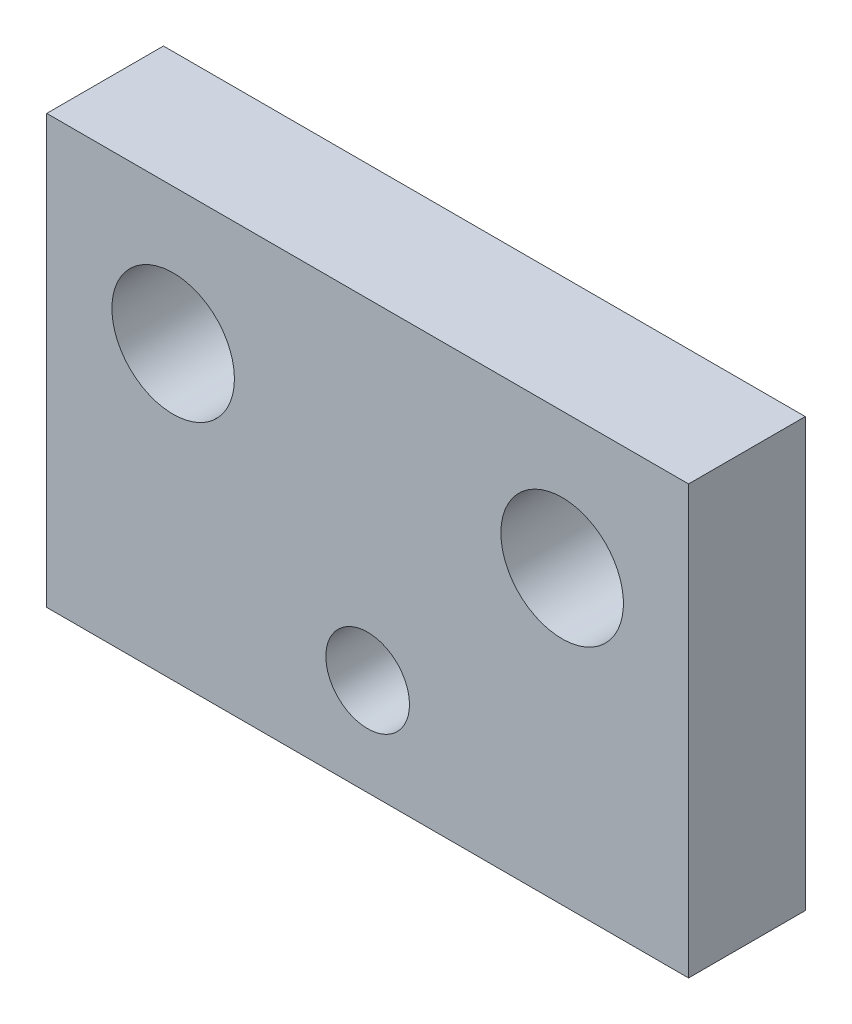
ISO-10303-21;
HEADER;
FILE_DESCRIPTION(('STEP AP214'),'2;1');
FILE_NAME('part.step','',(''),(''),'','','');
FILE_SCHEMA(('AUTOMOTIVE_DESIGN { 1 0 10303 214 1 1 1 1 }'));
ENDSEC;
DATA;
#1=APPLICATION_CONTEXT('core data for automotive mechanical design processes');
#2=APPLICATION_PROTOCOL_DEFINITION('international standard','automotive_design',2000,#1);
#3=PRODUCT_CONTEXT('',#1,'mechanical');
#4=PRODUCT('Part','Part','',(#3));
#5=PRODUCT_RELATED_PRODUCT_CATEGORY('part','',(#4));
#6=PRODUCT_DEFINITION_FORMATION('','',#4);
#7=PRODUCT_DEFINITION_CONTEXT('part definition',#1,'design');
#8=PRODUCT_DEFINITION('design','',#6,#7);
#9=PRODUCT_DEFINITION_SHAPE('','',#8);
#10=(LENGTH_UNIT() NAMED_UNIT(*) SI_UNIT(.MILLI.,.METRE.));
#11=(NAMED_UNIT(*) PLANE_ANGLE_UNIT() SI_UNIT($,.RADIAN.));
#12=(NAMED_UNIT(*) SI_UNIT($,.STERADIAN.) SOLID_ANGLE_UNIT());
#13=UNCERTAINTY_MEASURE_WITH_UNIT(LENGTH_MEASURE(1.E-05),#10,'distance_accuracy_value','');
#14=(GEOMETRIC_REPRESENTATION_CONTEXT(3) GLOBAL_UNCERTAINTY_ASSIGNED_CONTEXT((#13)) GLOBAL_UNIT_ASSIGNED_CONTEXT((#10,
#11,#12)) REPRESENTATION_CONTEXT('',''));
#15=CARTESIAN_POINT('',(0.,0.,0.));
#16=DIRECTION('',(0.,0.,1.));
#17=DIRECTION('',(1.,0.,0.));
#18=AXIS2_PLACEMENT_3D('',#15,#16,#17);
#19=CARTESIAN_POINT('',(0.,0.,6.));
#20=DIRECTION('',(0.,0.,1.));
#21=DIRECTION('',(1.,0.,0.));
#22=AXIS2_PLACEMENT_3D('',#19,#20,#21);
#23=PLANE('',#22);
#24=CARTESIAN_POINT('',(0.,5.,6.));
#25=DIRECTION('',(0.,0.,1.));
#26=DIRECTION('',(1.,0.,0.));
#27=AXIS2_PLACEMENT_3D('',#24,#25,#26);
#28=CIRCLE('',#27,2.15);
#29=CARTESIAN_POINT('',(2.14999999999999,5.,6.));
#30=VERTEX_POINT('',#29);
#31=EDGE_CURVE('E141',#30,#30,#28,.T.);
#32=ORIENTED_EDGE('',*,*,#31,.F.);
#33=EDGE_LOOP('',(#32));
#34=FACE_BOUND('',#33,.T.);
#35=DIRECTION('',(0.,1.,0.));
#36=VECTOR('',#35,1.);
#37=CARTESIAN_POINT('',(16.5,22.,6.));
#38=LINE('',#37,#36);
#39=CARTESIAN_POINT('',(16.5,0.,6.));
#40=VERTEX_POINT('',#39);
#41=CARTESIAN_POINT('',(16.5,22.,6.));
#42=VERTEX_POINT('',#41);
#43=EDGE_CURVE('E98',#40,#42,#38,.T.);
#44=ORIENTED_EDGE('',*,*,#43,.T.);
#45=DIRECTION('',(-1.,0.,0.));
#46=VECTOR('',#45,1.);
#47=CARTESIAN_POINT('',(-16.5,22.,6.));
#48=LINE('',#47,#46);
#49=CARTESIAN_POINT('',(-16.5,22.,6.));
#50=VERTEX_POINT('',#49);
#51=EDGE_CURVE('E93',#42,#50,#48,.T.);
#52=ORIENTED_EDGE('',*,*,#51,.T.);
#53=DIRECTION('',(0.,-1.,0.));
#54=VECTOR('',#53,1.);
#55=CARTESIAN_POINT('',(-16.5,22.,6.));
#56=LINE('',#55,#54);
#57=CARTESIAN_POINT('',(-16.5,0.,6.));
#58=VERTEX_POINT('',#57);
#59=EDGE_CURVE('E96',#50,#58,#56,.T.);
#60=ORIENTED_EDGE('',*,*,#59,.T.);
#61=DIRECTION('',(1.,0.,0.));
#62=VECTOR('',#61,1.);
#63=CARTESIAN_POINT('',(-16.5,0.,6.));
#64=LINE('',#63,#62);
#65=EDGE_CURVE('E63',#58,#40,#64,.T.);
#66=ORIENTED_EDGE('',*,*,#65,.T.);
#67=EDGE_LOOP('',(#44,#52,#60,#66));
#68=FACE_BOUND('',#67,.T.);
#69=CARTESIAN_POINT('',(-10.,15.,6.));
#70=DIRECTION('',(0.,0.,1.));
#71=DIRECTION('',(1.,0.,0.));
#72=AXIS2_PLACEMENT_3D('',#69,#70,#71);
#73=CIRCLE('',#72,3.15);
#74=CARTESIAN_POINT('',(-6.85,15.,6.));
#75=VERTEX_POINT('',#74);
#76=EDGE_CURVE('E120',#75,#75,#73,.T.);
#77=ORIENTED_EDGE('',*,*,#76,.F.);
#78=EDGE_LOOP('',(#77));
#79=FACE_BOUND('',#78,.T.);
#80=CARTESIAN_POINT('',(10.,15.,6.));
#81=DIRECTION('',(0.,0.,1.));
#82=DIRECTION('',(-1.,0.,0.));
#83=AXIS2_PLACEMENT_3D('',#80,#81,#82);
#84=CIRCLE('',#83,3.15);
#85=CARTESIAN_POINT('',(6.85,15.,6.));
#86=VERTEX_POINT('',#85);
#87=EDGE_CURVE('E149',#86,#86,#84,.T.);
#88=ORIENTED_EDGE('',*,*,#87,.F.);
#89=EDGE_LOOP('',(#88));
#90=FACE_BOUND('',#89,.T.);
#91=ADVANCED_FACE('F45',(#34,#68,#79,#90),#23,.T.);
#92=CARTESIAN_POINT('',(0.,0.,0.));
#93=DIRECTION('',(0.,0.,1.));
#94=DIRECTION('',(1.,0.,0.));
#95=AXIS2_PLACEMENT_3D('',#92,#93,#94);
#96=PLANE('',#95);
#97=DIRECTION('',(0.,1.,0.));
#98=VECTOR('',#97,1.);
#99=CARTESIAN_POINT('',(16.5,22.,0.));
#100=LINE('',#99,#98);
#101=CARTESIAN_POINT('',(16.5,0.,0.));
#102=VERTEX_POINT('',#101);
#103=CARTESIAN_POINT('',(16.5,22.,0.));
#104=VERTEX_POINT('',#103);
#105=EDGE_CURVE('E116',#102,#104,#100,.T.);
#106=ORIENTED_EDGE('',*,*,#105,.F.);
#107=DIRECTION('',(1.,0.,0.));
#108=VECTOR('',#107,1.);
#109=CARTESIAN_POINT('',(-16.5,0.,0.));
#110=LINE('',#109,#108);
#111=CARTESIAN_POINT('',(-16.5,0.,0.));
#112=VERTEX_POINT('',#111);
#113=EDGE_CURVE('E86',#112,#102,#110,.T.);
#114=ORIENTED_EDGE('',*,*,#113,.F.);
#115=DIRECTION('',(0.,-1.,0.));
#116=VECTOR('',#115,1.);
#117=CARTESIAN_POINT('',(-16.5,22.,0.));
#118=LINE('',#117,#116);
#119=CARTESIAN_POINT('',(-16.5,22.,0.));
#120=VERTEX_POINT('',#119);
#121=EDGE_CURVE('E80',#120,#112,#118,.T.);
#122=ORIENTED_EDGE('',*,*,#121,.F.);
#123=DIRECTION('',(-1.,0.,0.));
#124=VECTOR('',#123,1.);
#125=CARTESIAN_POINT('',(-16.5,22.,0.));
#126=LINE('',#125,#124);
#127=EDGE_CURVE('E103',#104,#120,#126,.T.);
#128=ORIENTED_EDGE('',*,*,#127,.F.);
#129=EDGE_LOOP('',(#106,#114,#122,#128));
#130=FACE_BOUND('',#129,.T.);
#131=CARTESIAN_POINT('',(-10.,15.,0.));
#132=DIRECTION('',(0.,0.,1.));
#133=DIRECTION('',(1.,0.,0.));
#134=AXIS2_PLACEMENT_3D('',#131,#132,#133);
#135=CIRCLE('',#134,3.15);
#136=CARTESIAN_POINT('',(-6.85,15.,0.));
#137=VERTEX_POINT('',#136);
#138=EDGE_CURVE('E137',#137,#137,#135,.T.);
#139=ORIENTED_EDGE('',*,*,#138,.T.);
#140=EDGE_LOOP('',(#139));
#141=FACE_BOUND('',#140,.T.);
#142=CARTESIAN_POINT('',(0.,5.,0.));
#143=DIRECTION('',(0.,0.,1.));
#144=DIRECTION('',(1.,0.,0.));
#145=AXIS2_PLACEMENT_3D('',#142,#143,#144);
#146=CIRCLE('',#145,2.15);
#147=CARTESIAN_POINT('',(2.14999999999999,5.,0.));
#148=VERTEX_POINT('',#147);
#149=EDGE_CURVE('E145',#148,#148,#146,.T.);
#150=ORIENTED_EDGE('',*,*,#149,.T.);
#151=EDGE_LOOP('',(#150));
#152=FACE_BOUND('',#151,.T.);
#153=CARTESIAN_POINT('',(10.,15.,0.));
#154=DIRECTION('',(0.,0.,1.));
#155=DIRECTION('',(-1.,0.,0.));
#156=AXIS2_PLACEMENT_3D('',#153,#154,#155);
#157=CIRCLE('',#156,3.15);
#158=CARTESIAN_POINT('',(6.85,15.,0.));
#159=VERTEX_POINT('',#158);
#160=EDGE_CURVE('E153',#159,#159,#157,.T.);
#161=ORIENTED_EDGE('',*,*,#160,.T.);
#162=EDGE_LOOP('',(#161));
#163=FACE_BOUND('',#162,.T.);
#164=ADVANCED_FACE('F131',(#130,#141,#152,#163),#96,.F.);
#165=CARTESIAN_POINT('',(16.5,22.,6.));
#166=DIRECTION('',(-1.,0.,0.));
#167=DIRECTION('',(0.,0.,1.));
#168=AXIS2_PLACEMENT_3D('',#165,#166,#167);
#169=PLANE('',#168);
#170=ORIENTED_EDGE('',*,*,#105,.T.);
#171=DIRECTION('',(0.,0.,-1.));
#172=VECTOR('',#171,1.);
#173=CARTESIAN_POINT('',(16.5,22.,6.));
#174=LINE('',#173,#172);
#175=EDGE_CURVE('E11',#42,#104,#174,.T.);
#176=ORIENTED_EDGE('',*,*,#175,.F.);
#177=ORIENTED_EDGE('',*,*,#43,.F.);
#178=DIRECTION('',(0.,0.,-1.));
#179=VECTOR('',#178,1.);
#180=CARTESIAN_POINT('',(16.5,0.,6.));
#181=LINE('',#180,#179);
#182=EDGE_CURVE('E112',#40,#102,#181,.T.);
#183=ORIENTED_EDGE('',*,*,#182,.T.);
#184=EDGE_LOOP('',(#170,#176,#177,#183));
#185=FACE_BOUND('',#184,.T.);
#186=ADVANCED_FACE('F47',(#185),#169,.F.);
#187=CARTESIAN_POINT('',(-16.5,22.,6.));
#188=DIRECTION('',(0.,-1.,0.));
#189=DIRECTION('',(1.,0.,0.));
#190=AXIS2_PLACEMENT_3D('',#187,#188,#189);
#191=PLANE('',#190);
#192=ORIENTED_EDGE('',*,*,#127,.T.);
#193=DIRECTION('',(0.,0.,-1.));
#194=VECTOR('',#193,1.);
#195=CARTESIAN_POINT('',(-16.5,22.,6.));
#196=LINE('',#195,#194);
#197=EDGE_CURVE('E55',#50,#120,#196,.T.);
#198=ORIENTED_EDGE('',*,*,#197,.F.);
#199=ORIENTED_EDGE('',*,*,#51,.F.);
#200=ORIENTED_EDGE('',*,*,#175,.T.);
#201=EDGE_LOOP('',(#192,#198,#199,#200));
#202=FACE_BOUND('',#201,.T.);
#203=ADVANCED_FACE('F102',(#202),#191,.F.);
#204=CARTESIAN_POINT('',(-16.5,22.,6.));
#205=DIRECTION('',(1.,0.,0.));
#206=DIRECTION('',(0.,0.,-1.));
#207=AXIS2_PLACEMENT_3D('',#204,#205,#206);
#208=PLANE('',#207);
#209=ORIENTED_EDGE('',*,*,#121,.T.);
#210=DIRECTION('',(0.,0.,-1.));
#211=VECTOR('',#210,1.);
#212=CARTESIAN_POINT('',(-16.5,0.,6.));
#213=LINE('',#212,#211);
#214=EDGE_CURVE('E105',#58,#112,#213,.T.);
#215=ORIENTED_EDGE('',*,*,#214,.F.);
#216=ORIENTED_EDGE('',*,*,#59,.F.);
#217=ORIENTED_EDGE('',*,*,#197,.T.);
#218=EDGE_LOOP('',(#209,#215,#216,#217));
#219=FACE_BOUND('',#218,.T.);
#220=ADVANCED_FACE('F106',(#219),#208,.F.);
#221=CARTESIAN_POINT('',(-16.5,0.,6.));
#222=DIRECTION('',(0.,1.,0.));
#223=DIRECTION('',(0.,0.,1.));
#224=AXIS2_PLACEMENT_3D('',#221,#222,#223);
#225=PLANE('',#224);
#226=ORIENTED_EDGE('',*,*,#113,.T.);
#227=ORIENTED_EDGE('',*,*,#182,.F.);
#228=ORIENTED_EDGE('',*,*,#65,.F.);
#229=ORIENTED_EDGE('',*,*,#214,.T.);
#230=EDGE_LOOP('',(#226,#227,#228,#229));
#231=FACE_BOUND('',#230,.T.);
#232=ADVANCED_FACE('F128',(#231),#225,.F.);
#233=CARTESIAN_POINT('',(-10.,15.,6.));
#234=DIRECTION('',(0.,0.,-1.));
#235=DIRECTION('',(-1.,0.,0.));
#236=AXIS2_PLACEMENT_3D('',#233,#234,#235);
#237=CYLINDRICAL_SURFACE('',#236,3.15);
#238=ORIENTED_EDGE('',*,*,#76,.T.);
#239=EDGE_LOOP('',(#238));
#240=FACE_BOUND('',#239,.T.);
#241=ORIENTED_EDGE('',*,*,#138,.F.);
#242=EDGE_LOOP('',(#241));
#243=FACE_BOUND('',#242,.T.);
#244=ADVANCED_FACE('F171',(#240,#243),#237,.F.);
#245=CARTESIAN_POINT('',(0.,5.,6.));
#246=DIRECTION('',(0.,0.,-1.));
#247=DIRECTION('',(-1.,0.,0.));
#248=AXIS2_PLACEMENT_3D('',#245,#246,#247);
#249=CYLINDRICAL_SURFACE('',#248,2.15);
#250=ORIENTED_EDGE('',*,*,#31,.T.);
#251=EDGE_LOOP('',(#250));
#252=FACE_BOUND('',#251,.T.);
#253=ORIENTED_EDGE('',*,*,#149,.F.);
#254=EDGE_LOOP('',(#253));
#255=FACE_BOUND('',#254,.T.);
#256=ADVANCED_FACE('F197',(#252,#255),#249,.F.);
#257=CARTESIAN_POINT('',(10.,15.,6.));
#258=DIRECTION('',(0.,0.,-1.));
#259=DIRECTION('',(-1.,0.,0.));
#260=AXIS2_PLACEMENT_3D('',#257,#258,#259);
#261=CYLINDRICAL_SURFACE('',#260,3.15);
#262=ORIENTED_EDGE('',*,*,#87,.T.);
#263=EDGE_LOOP('',(#262));
#264=FACE_BOUND('',#263,.T.);
#265=ORIENTED_EDGE('',*,*,#160,.F.);
#266=EDGE_LOOP('',(#265));
#267=FACE_BOUND('',#266,.T.);
#268=ADVANCED_FACE('F160',(#264,#267),#261,.F.);
#269=CLOSED_SHELL('',(#91,#164,#186,#203,#220,#232,#244,#256,#268));
#270=MANIFOLD_SOLID_BREP('B2',#269);
#271=ADVANCED_BREP_SHAPE_REPRESENTATION('',(#18,#270),#14);
#272=SHAPE_DEFINITION_REPRESENTATION(#9,#271);
ENDSEC;
END-ISO-10303-21;
